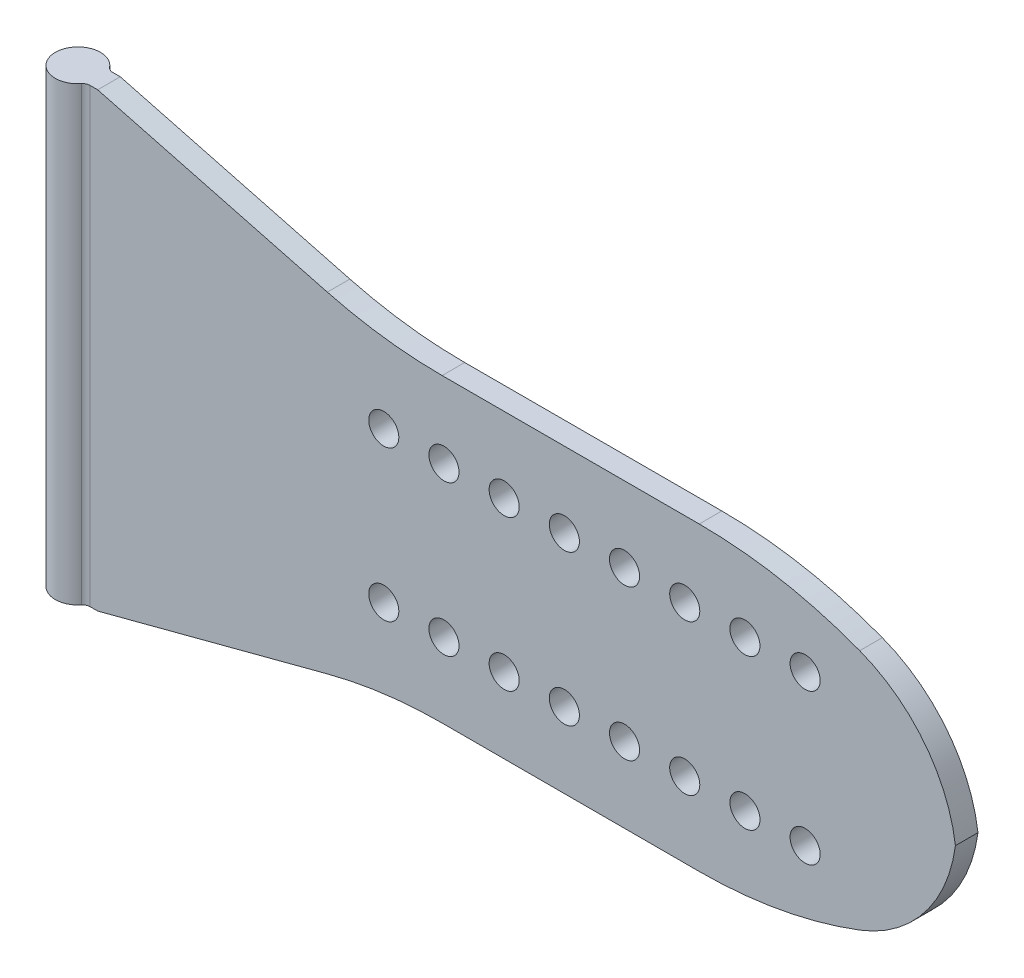
ISO-10303-21;
HEADER;
FILE_DESCRIPTION(('STEP AP214'),'2;1');
FILE_NAME('part.step','',(''),(''),'','','');
FILE_SCHEMA(('AUTOMOTIVE_DESIGN { 1 0 10303 214 1 1 1 1 }'));
ENDSEC;
DATA;
#1=APPLICATION_CONTEXT('core data for automotive mechanical design processes');
#2=APPLICATION_PROTOCOL_DEFINITION('international standard','automotive_design',2000,#1);
#3=PRODUCT_CONTEXT('',#1,'mechanical');
#4=PRODUCT('Part','Part','',(#3));
#5=PRODUCT_RELATED_PRODUCT_CATEGORY('part','',(#4));
#6=PRODUCT_DEFINITION_FORMATION('','',#4);
#7=PRODUCT_DEFINITION_CONTEXT('part definition',#1,'design');
#8=PRODUCT_DEFINITION('design','',#6,#7);
#9=PRODUCT_DEFINITION_SHAPE('','',#8);
#10=(LENGTH_UNIT() NAMED_UNIT(*) SI_UNIT(.MILLI.,.METRE.));
#11=(NAMED_UNIT(*) PLANE_ANGLE_UNIT() SI_UNIT($,.RADIAN.));
#12=(NAMED_UNIT(*) SI_UNIT($,.STERADIAN.) SOLID_ANGLE_UNIT());
#13=UNCERTAINTY_MEASURE_WITH_UNIT(LENGTH_MEASURE(1.E-05),#10,'distance_accuracy_value','');
#14=(GEOMETRIC_REPRESENTATION_CONTEXT(3) GLOBAL_UNCERTAINTY_ASSIGNED_CONTEXT((#13)) GLOBAL_UNIT_ASSIGNED_CONTEXT((#10,
#11,#12)) REPRESENTATION_CONTEXT('',''));
#15=CARTESIAN_POINT('',(0.,0.,0.));
#16=DIRECTION('',(0.,0.,1.));
#17=DIRECTION('',(1.,0.,0.));
#18=AXIS2_PLACEMENT_3D('',#15,#16,#17);
#19=CARTESIAN_POINT('',(0.,-15.,0.));
#20=DIRECTION('',(0.,1.,0.));
#21=DIRECTION('',(0.,0.,1.));
#22=AXIS2_PLACEMENT_3D('',#19,#20,#21);
#23=CYLINDRICAL_SURFACE('',#22,1.5);
#24=DIRECTION('',(0.,1.,0.));
#25=VECTOR('',#24,1.);
#26=CARTESIAN_POINT('',(1.1709371246997,-15.,0.9375));
#27=LINE('',#26,#25);
#28=CARTESIAN_POINT('',(1.1709371246997,-15.,0.9375));
#29=VERTEX_POINT('',#28);
#30=CARTESIAN_POINT('',(1.1709371246997,15.,0.9375));
#31=VERTEX_POINT('',#30);
#32=EDGE_CURVE('E195',#29,#31,#27,.T.);
#33=ORIENTED_EDGE('',*,*,#32,.T.);
#34=CARTESIAN_POINT('',(0.,15.,0.));
#35=DIRECTION('',(0.,1.,0.));
#36=DIRECTION('',(0.,0.,1.));
#37=AXIS2_PLACEMENT_3D('',#34,#35,#36);
#38=CIRCLE('',#37,1.5);
#39=CARTESIAN_POINT('',(1.1709371246997,15.,-0.9375));
#40=VERTEX_POINT('',#39);
#41=EDGE_CURVE('E175',#40,#31,#38,.T.);
#42=ORIENTED_EDGE('',*,*,#41,.F.);
#43=DIRECTION('',(0.,1.,0.));
#44=VECTOR('',#43,1.);
#45=CARTESIAN_POINT('',(1.1709371246997,-15.,-0.9375));
#46=LINE('',#45,#44);
#47=CARTESIAN_POINT('',(1.1709371246997,-15.,-0.9375));
#48=VERTEX_POINT('',#47);
#49=EDGE_CURVE('E153',#48,#40,#46,.T.);
#50=ORIENTED_EDGE('',*,*,#49,.F.);
#51=CARTESIAN_POINT('',(0.,-15.,0.));
#52=DIRECTION('',(0.,1.,0.));
#53=DIRECTION('',(0.,0.,1.));
#54=AXIS2_PLACEMENT_3D('',#51,#52,#53);
#55=CIRCLE('',#54,1.5);
#56=EDGE_CURVE('E181',#48,#29,#55,.T.);
#57=ORIENTED_EDGE('',*,*,#56,.T.);
#58=EDGE_LOOP('',(#33,#42,#50,#57));
#59=FACE_BOUND('',#58,.T.);
#60=ADVANCED_FACE('F34',(#59),#23,.T.);
#61=CARTESIAN_POINT('',(1.5612494995996,-15.,-1.25));
#62=DIRECTION('',(0.,1.,0.));
#63=DIRECTION('',(0.,0.,1.));
#64=AXIS2_PLACEMENT_3D('',#61,#62,#63);
#65=CYLINDRICAL_SURFACE('',#64,0.5);
#66=ORIENTED_EDGE('',*,*,#49,.T.);
#67=CARTESIAN_POINT('',(1.5612494995996,15.,-1.25));
#68=DIRECTION('',(0.,-1.,0.));
#69=DIRECTION('',(0.,0.,-1.));
#70=AXIS2_PLACEMENT_3D('',#67,#68,#69);
#71=CIRCLE('',#70,0.5);
#72=CARTESIAN_POINT('',(1.5612494995996,15.,-0.75));
#73=VERTEX_POINT('',#72);
#74=EDGE_CURVE('E173',#73,#40,#71,.T.);
#75=ORIENTED_EDGE('',*,*,#74,.F.);
#76=DIRECTION('',(0.,1.,0.));
#77=VECTOR('',#76,1.);
#78=CARTESIAN_POINT('',(1.5612494995996,-15.,-0.75));
#79=LINE('',#78,#77);
#80=CARTESIAN_POINT('',(1.5612494995996,-15.,-0.75));
#81=VERTEX_POINT('',#80);
#82=EDGE_CURVE('E197',#81,#73,#79,.T.);
#83=ORIENTED_EDGE('',*,*,#82,.F.);
#84=CARTESIAN_POINT('',(1.5612494995996,-15.,-1.25));
#85=DIRECTION('',(0.,-1.,0.));
#86=DIRECTION('',(0.,0.,-1.));
#87=AXIS2_PLACEMENT_3D('',#84,#85,#86);
#88=CIRCLE('',#87,0.5);
#89=EDGE_CURVE('E192',#81,#48,#88,.T.);
#90=ORIENTED_EDGE('',*,*,#89,.T.);
#91=EDGE_LOOP('',(#66,#75,#83,#90));
#92=FACE_BOUND('',#91,.T.);
#93=ADVANCED_FACE('F409',(#92),#65,.F.);
#94=CARTESIAN_POINT('',(1.5612494995996,-15.,-0.75));
#95=DIRECTION('',(0.,0.,-1.));
#96=DIRECTION('',(-1.,0.,0.));
#97=AXIS2_PLACEMENT_3D('',#94,#95,#96);
#98=PLANE('',#97);
#99=CARTESIAN_POINT('',(37.0772494995997,-5.00000000000008,-0.749999999999996));
#100=DIRECTION('',(0.,0.,-1.));
#101=DIRECTION('',(-1.,0.,0.));
#102=AXIS2_PLACEMENT_3D('',#99,#100,#101);
#103=CIRCLE('',#102,0.999999999999998);
#104=CARTESIAN_POINT('',(36.0772494995997,-5.00000000000008,-0.749999999999996));
#105=VERTEX_POINT('',#104);
#106=EDGE_CURVE('E370',#105,#105,#103,.T.);
#107=ORIENTED_EDGE('',*,*,#106,.F.);
#108=EDGE_LOOP('',(#107));
#109=FACE_BOUND('',#108,.T.);
#110=CARTESIAN_POINT('',(41.0772494995997,-5.00000000000006,-0.749999999999996));
#111=DIRECTION('',(0.,0.,-1.));
#112=DIRECTION('',(-1.,0.,0.));
#113=AXIS2_PLACEMENT_3D('',#110,#111,#112);
#114=CIRCLE('',#113,0.999999999999998);
#115=CARTESIAN_POINT('',(40.0772494995997,-5.00000000000006,-0.749999999999996));
#116=VERTEX_POINT('',#115);
#117=EDGE_CURVE('E367',#116,#116,#114,.T.);
#118=ORIENTED_EDGE('',*,*,#117,.F.);
#119=EDGE_LOOP('',(#118));
#120=FACE_BOUND('',#119,.T.);
#121=CARTESIAN_POINT('',(45.0772494995997,-5.00000000000003,-0.749999999999995));
#122=DIRECTION('',(0.,0.,-1.));
#123=DIRECTION('',(-1.,0.,0.));
#124=AXIS2_PLACEMENT_3D('',#121,#122,#123);
#125=CIRCLE('',#124,0.999999999999998);
#126=CARTESIAN_POINT('',(44.0772494995997,-5.00000000000003,-0.749999999999995));
#127=VERTEX_POINT('',#126);
#128=EDGE_CURVE('E364',#127,#127,#125,.T.);
#129=ORIENTED_EDGE('',*,*,#128,.F.);
#130=EDGE_LOOP('',(#129));
#131=FACE_BOUND('',#130,.T.);
#132=CARTESIAN_POINT('',(21.0772494995996,4.9999999999998,-0.749999999999998));
#133=DIRECTION('',(0.,0.,-1.));
#134=DIRECTION('',(-1.,0.,0.));
#135=AXIS2_PLACEMENT_3D('',#132,#133,#134);
#136=CIRCLE('',#135,0.999999999999998);
#137=CARTESIAN_POINT('',(20.0772494995996,4.9999999999998,-0.749999999999998));
#138=VERTEX_POINT('',#137);
#139=EDGE_CURVE('E361',#138,#138,#136,.T.);
#140=ORIENTED_EDGE('',*,*,#139,.F.);
#141=EDGE_LOOP('',(#140));
#142=FACE_BOUND('',#141,.T.);
#143=CARTESIAN_POINT('',(33.0772494995997,-5.00000000000011,-0.749999999999997));
#144=DIRECTION('',(0.,0.,-1.));
#145=DIRECTION('',(-1.,0.,0.));
#146=AXIS2_PLACEMENT_3D('',#143,#144,#145);
#147=CIRCLE('',#146,0.999999999999998);
#148=CARTESIAN_POINT('',(32.0772494995997,-5.00000000000011,-0.749999999999997));
#149=VERTEX_POINT('',#148);
#150=EDGE_CURVE('E358',#149,#149,#147,.T.);
#151=ORIENTED_EDGE('',*,*,#150,.F.);
#152=EDGE_LOOP('',(#151));
#153=FACE_BOUND('',#152,.T.);
#154=CARTESIAN_POINT('',(29.0772494995997,-5.00000000000014,-0.749999999999997));
#155=DIRECTION('',(0.,0.,-1.));
#156=DIRECTION('',(-1.,0.,0.));
#157=AXIS2_PLACEMENT_3D('',#154,#155,#156);
#158=CIRCLE('',#157,0.999999999999998);
#159=CARTESIAN_POINT('',(28.0772494995997,-5.00000000000014,-0.749999999999997));
#160=VERTEX_POINT('',#159);
#161=EDGE_CURVE('E355',#160,#160,#158,.T.);
#162=ORIENTED_EDGE('',*,*,#161,.F.);
#163=EDGE_LOOP('',(#162));
#164=FACE_BOUND('',#163,.T.);
#165=CARTESIAN_POINT('',(25.0772494995997,-5.00000000000017,-0.749999999999997));
#166=DIRECTION('',(0.,0.,-1.));
#167=DIRECTION('',(-1.,0.,0.));
#168=AXIS2_PLACEMENT_3D('',#165,#166,#167);
#169=CIRCLE('',#168,0.999999999999998);
#170=CARTESIAN_POINT('',(24.0772494995997,-5.00000000000017,-0.749999999999998));
#171=VERTEX_POINT('',#170);
#172=EDGE_CURVE('E352',#171,#171,#169,.T.);
#173=ORIENTED_EDGE('',*,*,#172,.F.);
#174=EDGE_LOOP('',(#173));
#175=FACE_BOUND('',#174,.T.);
#176=CARTESIAN_POINT('',(21.0772494995997,-5.0000000000002,-0.749999999999998));
#177=DIRECTION('',(0.,0.,-1.));
#178=DIRECTION('',(-1.,0.,0.));
#179=AXIS2_PLACEMENT_3D('',#176,#177,#178);
#180=CIRCLE('',#179,0.999999999999998);
#181=CARTESIAN_POINT('',(20.0772494995997,-5.0000000000002,-0.749999999999998));
#182=VERTEX_POINT('',#181);
#183=EDGE_CURVE('E349',#182,#182,#180,.T.);
#184=ORIENTED_EDGE('',*,*,#183,.F.);
#185=EDGE_LOOP('',(#184));
#186=FACE_BOUND('',#185,.T.);
#187=CARTESIAN_POINT('',(41.0772494995996,4.99999999999994,-0.749999999999996));
#188=DIRECTION('',(0.,0.,-1.));
#189=DIRECTION('',(-1.,0.,0.));
#190=AXIS2_PLACEMENT_3D('',#187,#188,#189);
#191=CIRCLE('',#190,0.999999999999998);
#192=CARTESIAN_POINT('',(40.0772494995996,4.99999999999994,-0.749999999999996));
#193=VERTEX_POINT('',#192);
#194=EDGE_CURVE('E346',#193,#193,#191,.T.);
#195=ORIENTED_EDGE('',*,*,#194,.F.);
#196=EDGE_LOOP('',(#195));
#197=FACE_BOUND('',#196,.T.);
#198=CARTESIAN_POINT('',(45.0772494995996,4.99999999999997,-0.749999999999995));
#199=DIRECTION('',(0.,0.,-1.));
#200=DIRECTION('',(-1.,0.,0.));
#201=AXIS2_PLACEMENT_3D('',#198,#199,#200);
#202=CIRCLE('',#201,0.999999999999998);
#203=CARTESIAN_POINT('',(44.0772494995996,4.99999999999997,-0.749999999999995));
#204=VERTEX_POINT('',#203);
#205=EDGE_CURVE('E343',#204,#204,#202,.T.);
#206=ORIENTED_EDGE('',*,*,#205,.F.);
#207=EDGE_LOOP('',(#206));
#208=FACE_BOUND('',#207,.T.);
#209=CARTESIAN_POINT('',(49.0772494995996,5.,-0.749999999999995));
#210=DIRECTION('',(0.,0.,-1.));
#211=DIRECTION('',(-1.,0.,0.));
#212=AXIS2_PLACEMENT_3D('',#209,#210,#211);
#213=CIRCLE('',#212,0.999999999999998);
#214=CARTESIAN_POINT('',(48.0772494995996,5.,-0.749999999999995));
#215=VERTEX_POINT('',#214);
#216=EDGE_CURVE('E340',#215,#215,#213,.T.);
#217=ORIENTED_EDGE('',*,*,#216,.F.);
#218=EDGE_LOOP('',(#217));
#219=FACE_BOUND('',#218,.T.);
#220=CARTESIAN_POINT('',(49.1512494995996,-1.30626791769696,-0.749999999999995));
#221=DIRECTION('',(0.,0.,-1.));
#222=DIRECTION('',(-1.,0.,0.));
#223=AXIS2_PLACEMENT_3D('',#220,#221,#222);
#224=CIRCLE('',#223,10.);
#225=CARTESIAN_POINT('',(52.7059780699364,8.04059812345455,-0.749999999999994));
#226=VERTEX_POINT('',#225);
#227=CARTESIAN_POINT('',(59.0655656195948,0.,-0.749999999999994));
#228=VERTEX_POINT('',#227);
#229=EDGE_CURVE('E50',#226,#228,#224,.T.);
#230=ORIENTED_EDGE('',*,*,#229,.T.);
#231=CARTESIAN_POINT('',(49.1512494995996,1.30626791769696,-0.749999999999995));
#232=DIRECTION('',(0.,0.,-1.));
#233=DIRECTION('',(-1.,0.,0.));
#234=AXIS2_PLACEMENT_3D('',#231,#232,#233);
#235=CIRCLE('',#234,10.);
#236=CARTESIAN_POINT('',(52.7059780699364,-8.04059812345455,-0.749999999999994));
#237=VERTEX_POINT('',#236);
#238=EDGE_CURVE('E43',#228,#237,#235,.T.);
#239=ORIENTED_EDGE('',*,*,#238,.T.);
#240=CARTESIAN_POINT('',(42.041792358926,20.,-0.749999999999996));
#241=DIRECTION('',(0.,0.,-1.));
#242=DIRECTION('',(-1.,0.,0.));
#243=AXIS2_PLACEMENT_3D('',#240,#241,#242);
#244=CIRCLE('',#243,30.);
#245=CARTESIAN_POINT('',(42.041792358926,-10.,-0.749999999999996));
#246=VERTEX_POINT('',#245);
#247=EDGE_CURVE('E219',#237,#246,#244,.T.);
#248=ORIENTED_EDGE('',*,*,#247,.T.);
#249=DIRECTION('',(1.,0.,0.));
#250=VECTOR('',#249,1.);
#251=CARTESIAN_POINT('',(1.5612494995996,-10.,-0.75));
#252=LINE('',#251,#250);
#253=CARTESIAN_POINT('',(24.9561765158804,-10.,-0.749999999999997));
#254=VERTEX_POINT('',#253);
#255=EDGE_CURVE('E338',#254,#246,#252,.T.);
#256=ORIENTED_EDGE('',*,*,#255,.F.);
#257=CARTESIAN_POINT('',(24.9561765158804,-40.,-0.749999999999997));
#258=DIRECTION('',(0.,0.,-1.));
#259=DIRECTION('',(-1.,0.,0.));
#260=AXIS2_PLACEMENT_3D('',#257,#258,#259);
#261=CIRCLE('',#260,30.);
#262=CARTESIAN_POINT('',(17.3258846413979,-10.9865781764679,-0.749999999999998));
#263=VERTEX_POINT('',#262);
#264=EDGE_CURVE('E230',#254,#263,#261,.F.);
#265=ORIENTED_EDGE('',*,*,#264,.T.);
#266=DIRECTION('',(0.967114060784402,0.254343062482749,0.));
#267=VECTOR('',#266,1.);
#268=CARTESIAN_POINT('',(1.59385345788989,-15.123973291003,-0.75));
#269=LINE('',#268,#267);
#270=CARTESIAN_POINT('',(2.0652494995996,-15.,-0.749999999999997));
#271=VERTEX_POINT('',#270);
#272=EDGE_CURVE('E317',#271,#263,#269,.T.);
#273=ORIENTED_EDGE('',*,*,#272,.F.);
#274=DIRECTION('',(-1.,0.,0.));
#275=VECTOR('',#274,1.);
#276=CARTESIAN_POINT('',(1.5612494995996,-15.,-0.75));
#277=LINE('',#276,#275);
#278=EDGE_CURVE('E190',#271,#81,#277,.T.);
#279=ORIENTED_EDGE('',*,*,#278,.T.);
#280=ORIENTED_EDGE('',*,*,#82,.T.);
#281=DIRECTION('',(-1.,0.,0.));
#282=VECTOR('',#281,1.);
#283=CARTESIAN_POINT('',(1.5612494995996,15.,-0.75));
#284=LINE('',#283,#282);
#285=CARTESIAN_POINT('',(2.06524949959961,15.,-0.75));
#286=VERTEX_POINT('',#285);
#287=EDGE_CURVE('E171',#286,#73,#284,.T.);
#288=ORIENTED_EDGE('',*,*,#287,.F.);
#289=DIRECTION('',(-0.967114060784402,0.254343062482749,0.));
#290=VECTOR('',#289,1.);
#291=CARTESIAN_POINT('',(8.97321601759084,13.1832614880099,-0.749999999999999));
#292=LINE('',#291,#290);
#293=CARTESIAN_POINT('',(17.325884641398,10.9865781764679,-0.749999999999998));
#294=VERTEX_POINT('',#293);
#295=EDGE_CURVE('E148',#294,#286,#292,.T.);
#296=ORIENTED_EDGE('',*,*,#295,.F.);
#297=CARTESIAN_POINT('',(24.9561765158804,40.,-0.749999999999997));
#298=DIRECTION('',(0.,0.,-1.));
#299=DIRECTION('',(-1.,0.,0.));
#300=AXIS2_PLACEMENT_3D('',#297,#298,#299);
#301=CIRCLE('',#300,30.);
#302=CARTESIAN_POINT('',(24.9561765158804,10.,-0.749999999999997));
#303=VERTEX_POINT('',#302);
#304=EDGE_CURVE('E233',#294,#303,#301,.F.);
#305=ORIENTED_EDGE('',*,*,#304,.T.);
#306=DIRECTION('',(-1.,0.,0.));
#307=VECTOR('',#306,1.);
#308=CARTESIAN_POINT('',(1.5612494995996,10.,-0.75));
#309=LINE('',#308,#307);
#310=CARTESIAN_POINT('',(42.041792358926,10.,-0.749999999999996));
#311=VERTEX_POINT('',#310);
#312=EDGE_CURVE('E320',#311,#303,#309,.T.);
#313=ORIENTED_EDGE('',*,*,#312,.F.);
#314=CARTESIAN_POINT('',(42.041792358926,-20.,-0.749999999999996));
#315=DIRECTION('',(0.,0.,-1.));
#316=DIRECTION('',(-1.,0.,0.));
#317=AXIS2_PLACEMENT_3D('',#314,#315,#316);
#318=CIRCLE('',#317,30.);
#319=EDGE_CURVE('E217',#311,#226,#318,.T.);
#320=ORIENTED_EDGE('',*,*,#319,.T.);
#321=EDGE_LOOP('',(#230,#239,#248,#256,#265,#273,#279,#280,#288,#296,#305,#313,#320));
#322=FACE_BOUND('',#321,.T.);
#323=CARTESIAN_POINT('',(37.0772494995996,4.99999999999992,-0.749999999999996));
#324=DIRECTION('',(0.,0.,-1.));
#325=DIRECTION('',(-1.,0.,0.));
#326=AXIS2_PLACEMENT_3D('',#323,#324,#325);
#327=CIRCLE('',#326,0.999999999999998);
#328=CARTESIAN_POINT('',(36.0772494995996,4.99999999999992,-0.749999999999996));
#329=VERTEX_POINT('',#328);
#330=EDGE_CURVE('E335',#329,#329,#327,.T.);
#331=ORIENTED_EDGE('',*,*,#330,.F.);
#332=EDGE_LOOP('',(#331));
#333=FACE_BOUND('',#332,.T.);
#334=CARTESIAN_POINT('',(33.0772494995996,4.99999999999989,-0.749999999999997));
#335=DIRECTION('',(0.,0.,-1.));
#336=DIRECTION('',(-1.,0.,0.));
#337=AXIS2_PLACEMENT_3D('',#334,#335,#336);
#338=CIRCLE('',#337,0.999999999999998);
#339=CARTESIAN_POINT('',(32.0772494995996,4.99999999999989,-0.749999999999997));
#340=VERTEX_POINT('',#339);
#341=EDGE_CURVE('E332',#340,#340,#338,.T.);
#342=ORIENTED_EDGE('',*,*,#341,.F.);
#343=EDGE_LOOP('',(#342));
#344=FACE_BOUND('',#343,.T.);
#345=CARTESIAN_POINT('',(29.0772494995996,4.99999999999986,-0.749999999999997));
#346=DIRECTION('',(0.,0.,-1.));
#347=DIRECTION('',(-1.,0.,0.));
#348=AXIS2_PLACEMENT_3D('',#345,#346,#347);
#349=CIRCLE('',#348,0.999999999999998);
#350=CARTESIAN_POINT('',(28.0772494995996,4.99999999999986,-0.749999999999997));
#351=VERTEX_POINT('',#350);
#352=EDGE_CURVE('E329',#351,#351,#349,.T.);
#353=ORIENTED_EDGE('',*,*,#352,.F.);
#354=EDGE_LOOP('',(#353));
#355=FACE_BOUND('',#354,.T.);
#356=CARTESIAN_POINT('',(25.0772494995996,4.99999999999983,-0.749999999999997));
#357=DIRECTION('',(0.,0.,-1.));
#358=DIRECTION('',(-1.,0.,0.));
#359=AXIS2_PLACEMENT_3D('',#356,#357,#358);
#360=CIRCLE('',#359,0.999999999999998);
#361=CARTESIAN_POINT('',(24.0772494995996,4.99999999999983,-0.749999999999998));
#362=VERTEX_POINT('',#361);
#363=EDGE_CURVE('E326',#362,#362,#360,.T.);
#364=ORIENTED_EDGE('',*,*,#363,.F.);
#365=EDGE_LOOP('',(#364));
#366=FACE_BOUND('',#365,.T.);
#367=CARTESIAN_POINT('',(49.0772494995997,-5.,-0.749999999999995));
#368=DIRECTION('',(0.,0.,-1.));
#369=DIRECTION('',(-1.,0.,0.));
#370=AXIS2_PLACEMENT_3D('',#367,#368,#369);
#371=CIRCLE('',#370,0.999999999999998);
#372=CARTESIAN_POINT('',(48.0772494995997,-5.,-0.749999999999995));
#373=VERTEX_POINT('',#372);
#374=EDGE_CURVE('E323',#373,#373,#371,.T.);
#375=ORIENTED_EDGE('',*,*,#374,.F.);
#376=EDGE_LOOP('',(#375));
#377=FACE_BOUND('',#376,.T.);
#378=ADVANCED_FACE('F245',(#109,#120,#131,#142,#153,#164,#175,#186,#197,#208,#219,#322,#333,
#344,#355,#366,#377),#98,.T.);
#379=CARTESIAN_POINT('',(59.1512494995996,-15.,0.749999999999994));
#380=DIRECTION('',(0.,0.,1.));
#381=DIRECTION('',(1.,0.,0.));
#382=AXIS2_PLACEMENT_3D('',#379,#380,#381);
#383=PLANE('',#382);
#384=CARTESIAN_POINT('',(37.0772494995997,-5.00000000000008,0.75));
#385=DIRECTION('',(0.,0.,1.));
#386=DIRECTION('',(1.,0.,0.));
#387=AXIS2_PLACEMENT_3D('',#384,#385,#386);
#388=CIRCLE('',#387,0.999999999999998);
#389=CARTESIAN_POINT('',(38.0772494995997,-5.00000000000008,0.75));
#390=VERTEX_POINT('',#389);
#391=EDGE_CURVE('E272',#390,#390,#388,.T.);
#392=ORIENTED_EDGE('',*,*,#391,.F.);
#393=EDGE_LOOP('',(#392));
#394=FACE_BOUND('',#393,.T.);
#395=CARTESIAN_POINT('',(41.0772494995997,-5.00000000000006,0.75));
#396=DIRECTION('',(0.,0.,1.));
#397=DIRECTION('',(1.,0.,0.));
#398=AXIS2_PLACEMENT_3D('',#395,#396,#397);
#399=CIRCLE('',#398,0.999999999999998);
#400=CARTESIAN_POINT('',(42.0772494995997,-5.00000000000006,0.75));
#401=VERTEX_POINT('',#400);
#402=EDGE_CURVE('E278',#401,#401,#399,.T.);
#403=ORIENTED_EDGE('',*,*,#402,.F.);
#404=EDGE_LOOP('',(#403));
#405=FACE_BOUND('',#404,.T.);
#406=CARTESIAN_POINT('',(45.0772494995997,-5.00000000000003,0.75));
#407=DIRECTION('',(0.,0.,1.));
#408=DIRECTION('',(1.,0.,0.));
#409=AXIS2_PLACEMENT_3D('',#406,#407,#408);
#410=CIRCLE('',#409,0.999999999999998);
#411=CARTESIAN_POINT('',(46.0772494995997,-5.00000000000003,0.75));
#412=VERTEX_POINT('',#411);
#413=EDGE_CURVE('E281',#412,#412,#410,.T.);
#414=ORIENTED_EDGE('',*,*,#413,.F.);
#415=EDGE_LOOP('',(#414));
#416=FACE_BOUND('',#415,.T.);
#417=CARTESIAN_POINT('',(21.0772494995996,4.9999999999998,0.75));
#418=DIRECTION('',(0.,0.,1.));
#419=DIRECTION('',(1.,0.,0.));
#420=AXIS2_PLACEMENT_3D('',#417,#418,#419);
#421=CIRCLE('',#420,0.999999999999998);
#422=CARTESIAN_POINT('',(22.0772494995996,4.9999999999998,0.75));
#423=VERTEX_POINT('',#422);
#424=EDGE_CURVE('E284',#423,#423,#421,.T.);
#425=ORIENTED_EDGE('',*,*,#424,.F.);
#426=EDGE_LOOP('',(#425));
#427=FACE_BOUND('',#426,.T.);
#428=CARTESIAN_POINT('',(33.0772494995997,-5.00000000000011,0.75));
#429=DIRECTION('',(0.,0.,1.));
#430=DIRECTION('',(1.,0.,0.));
#431=AXIS2_PLACEMENT_3D('',#428,#429,#430);
#432=CIRCLE('',#431,0.999999999999998);
#433=CARTESIAN_POINT('',(34.0772494995997,-5.00000000000011,0.75));
#434=VERTEX_POINT('',#433);
#435=EDGE_CURVE('E269',#434,#434,#432,.T.);
#436=ORIENTED_EDGE('',*,*,#435,.F.);
#437=EDGE_LOOP('',(#436));
#438=FACE_BOUND('',#437,.T.);
#439=CARTESIAN_POINT('',(29.0772494995997,-5.00000000000014,0.75));
#440=DIRECTION('',(0.,0.,1.));
#441=DIRECTION('',(1.,0.,0.));
#442=AXIS2_PLACEMENT_3D('',#439,#440,#441);
#443=CIRCLE('',#442,0.999999999999998);
#444=CARTESIAN_POINT('',(30.0772494995997,-5.00000000000014,0.75));
#445=VERTEX_POINT('',#444);
#446=EDGE_CURVE('E273',#445,#445,#443,.T.);
#447=ORIENTED_EDGE('',*,*,#446,.F.);
#448=EDGE_LOOP('',(#447));
#449=FACE_BOUND('',#448,.T.);
#450=CARTESIAN_POINT('',(25.0772494995997,-5.00000000000017,0.75));
#451=DIRECTION('',(0.,0.,1.));
#452=DIRECTION('',(1.,0.,0.));
#453=AXIS2_PLACEMENT_3D('',#450,#451,#452);
#454=CIRCLE('',#453,0.999999999999998);
#455=CARTESIAN_POINT('',(26.0772494995997,-5.00000000000017,0.75));
#456=VERTEX_POINT('',#455);
#457=EDGE_CURVE('E266',#456,#456,#454,.T.);
#458=ORIENTED_EDGE('',*,*,#457,.F.);
#459=EDGE_LOOP('',(#458));
#460=FACE_BOUND('',#459,.T.);
#461=CARTESIAN_POINT('',(21.0772494995997,-5.0000000000002,0.75));
#462=DIRECTION('',(0.,0.,1.));
#463=DIRECTION('',(1.,0.,0.));
#464=AXIS2_PLACEMENT_3D('',#461,#462,#463);
#465=CIRCLE('',#464,0.999999999999998);
#466=CARTESIAN_POINT('',(22.0772494995997,-5.0000000000002,0.75));
#467=VERTEX_POINT('',#466);
#468=EDGE_CURVE('E261',#467,#467,#465,.T.);
#469=ORIENTED_EDGE('',*,*,#468,.F.);
#470=EDGE_LOOP('',(#469));
#471=FACE_BOUND('',#470,.T.);
#472=CARTESIAN_POINT('',(41.0772494995996,4.99999999999994,0.75));
#473=DIRECTION('',(0.,0.,1.));
#474=DIRECTION('',(1.,0.,0.));
#475=AXIS2_PLACEMENT_3D('',#472,#473,#474);
#476=CIRCLE('',#475,0.999999999999998);
#477=CARTESIAN_POINT('',(42.0772494995996,4.99999999999994,0.75));
#478=VERTEX_POINT('',#477);
#479=EDGE_CURVE('E293',#478,#478,#476,.T.);
#480=ORIENTED_EDGE('',*,*,#479,.F.);
#481=EDGE_LOOP('',(#480));
#482=FACE_BOUND('',#481,.T.);
#483=CARTESIAN_POINT('',(45.0772494995996,4.99999999999997,0.75));
#484=DIRECTION('',(0.,0.,1.));
#485=DIRECTION('',(1.,0.,0.));
#486=AXIS2_PLACEMENT_3D('',#483,#484,#485);
#487=CIRCLE('',#486,0.999999999999998);
#488=CARTESIAN_POINT('',(46.0772494995996,4.99999999999997,0.75));
#489=VERTEX_POINT('',#488);
#490=EDGE_CURVE('E302',#489,#489,#487,.T.);
#491=ORIENTED_EDGE('',*,*,#490,.F.);
#492=EDGE_LOOP('',(#491));
#493=FACE_BOUND('',#492,.T.);
#494=CARTESIAN_POINT('',(49.0772494995996,5.,0.75));
#495=DIRECTION('',(0.,0.,1.));
#496=DIRECTION('',(1.,0.,0.));
#497=AXIS2_PLACEMENT_3D('',#494,#495,#496);
#498=CIRCLE('',#497,0.999999999999998);
#499=CARTESIAN_POINT('',(50.0772494995996,5.,0.75));
#500=VERTEX_POINT('',#499);
#501=EDGE_CURVE('E305',#500,#500,#498,.T.);
#502=ORIENTED_EDGE('',*,*,#501,.F.);
#503=EDGE_LOOP('',(#502));
#504=FACE_BOUND('',#503,.T.);
#505=CARTESIAN_POINT('',(42.041792358926,20.,0.749999999999995));
#506=DIRECTION('',(0.,0.,1.));
#507=DIRECTION('',(1.,0.,0.));
#508=AXIS2_PLACEMENT_3D('',#505,#506,#507);
#509=CIRCLE('',#508,30.);
#510=CARTESIAN_POINT('',(42.041792358926,-10.,0.75));
#511=VERTEX_POINT('',#510);
#512=CARTESIAN_POINT('',(52.7059780699364,-8.04059812345455,0.749999999999994));
#513=VERTEX_POINT('',#512);
#514=EDGE_CURVE('E215',#511,#513,#509,.T.);
#515=ORIENTED_EDGE('',*,*,#514,.T.);
#516=CARTESIAN_POINT('',(49.1512494995996,1.30626791769696,0.749999999999995));
#517=DIRECTION('',(0.,0.,1.));
#518=DIRECTION('',(1.,0.,0.));
#519=AXIS2_PLACEMENT_3D('',#516,#517,#518);
#520=CIRCLE('',#519,10.);
#521=CARTESIAN_POINT('',(59.0655656195948,0.,0.749999999999994));
#522=VERTEX_POINT('',#521);
#523=EDGE_CURVE('E240',#513,#522,#520,.T.);
#524=ORIENTED_EDGE('',*,*,#523,.T.);
#525=CARTESIAN_POINT('',(49.1512494995996,-1.30626791769696,0.749999999999995));
#526=DIRECTION('',(0.,0.,1.));
#527=DIRECTION('',(1.,0.,0.));
#528=AXIS2_PLACEMENT_3D('',#525,#526,#527);
#529=CIRCLE('',#528,10.);
#530=CARTESIAN_POINT('',(52.7059780699364,8.04059812345455,0.749999999999994));
#531=VERTEX_POINT('',#530);
#532=EDGE_CURVE('E238',#522,#531,#529,.T.);
#533=ORIENTED_EDGE('',*,*,#532,.T.);
#534=CARTESIAN_POINT('',(42.041792358926,-20.,0.749999999999995));
#535=DIRECTION('',(0.,0.,1.));
#536=DIRECTION('',(1.,0.,0.));
#537=AXIS2_PLACEMENT_3D('',#534,#535,#536);
#538=CIRCLE('',#537,30.);
#539=CARTESIAN_POINT('',(42.041792358926,10.,0.75));
#540=VERTEX_POINT('',#539);
#541=EDGE_CURVE('E213',#531,#540,#538,.T.);
#542=ORIENTED_EDGE('',*,*,#541,.T.);
#543=DIRECTION('',(1.,0.,0.));
#544=VECTOR('',#543,1.);
#545=CARTESIAN_POINT('',(49.0772494995996,10.,0.75));
#546=LINE('',#545,#544);
#547=CARTESIAN_POINT('',(24.9561765158804,10.,0.75));
#548=VERTEX_POINT('',#547);
#549=EDGE_CURVE('E163',#548,#540,#546,.T.);
#550=ORIENTED_EDGE('',*,*,#549,.F.);
#551=CARTESIAN_POINT('',(24.9561765158804,40.,0.749999999999998));
#552=DIRECTION('',(0.,0.,1.));
#553=DIRECTION('',(1.,0.,0.));
#554=AXIS2_PLACEMENT_3D('',#551,#552,#553);
#555=CIRCLE('',#554,30.);
#556=CARTESIAN_POINT('',(17.325884641398,10.9865781764679,0.75));
#557=VERTEX_POINT('',#556);
#558=EDGE_CURVE('E162',#548,#557,#555,.F.);
#559=ORIENTED_EDGE('',*,*,#558,.T.);
#560=DIRECTION('',(0.967114060784403,-0.254343062482749,0.));
#561=VECTOR('',#560,1.);
#562=CARTESIAN_POINT('',(21.0772494995996,10.,0.75));
#563=LINE('',#562,#561);
#564=CARTESIAN_POINT('',(2.0652494995996,15.,0.75));
#565=VERTEX_POINT('',#564);
#566=EDGE_CURVE('E145',#565,#557,#563,.T.);
#567=ORIENTED_EDGE('',*,*,#566,.F.);
#568=DIRECTION('',(1.,0.,0.));
#569=VECTOR('',#568,1.);
#570=CARTESIAN_POINT('',(59.1512494995996,15.,0.749999999999994));
#571=LINE('',#570,#569);
#572=CARTESIAN_POINT('',(1.5612494995996,15.,0.75));
#573=VERTEX_POINT('',#572);
#574=EDGE_CURVE('E160',#573,#565,#571,.T.);
#575=ORIENTED_EDGE('',*,*,#574,.F.);
#576=DIRECTION('',(0.,1.,0.));
#577=VECTOR('',#576,1.);
#578=CARTESIAN_POINT('',(1.5612494995996,-15.,0.75));
#579=LINE('',#578,#577);
#580=CARTESIAN_POINT('',(1.5612494995996,-15.,0.75));
#581=VERTEX_POINT('',#580);
#582=EDGE_CURVE('E200',#581,#573,#579,.T.);
#583=ORIENTED_EDGE('',*,*,#582,.F.);
#584=DIRECTION('',(1.,0.,0.));
#585=VECTOR('',#584,1.);
#586=CARTESIAN_POINT('',(59.1512494995996,-15.,0.749999999999994));
#587=LINE('',#586,#585);
#588=CARTESIAN_POINT('',(2.06524949959962,-15.,0.75));
#589=VERTEX_POINT('',#588);
#590=EDGE_CURVE('E187',#581,#589,#587,.T.);
#591=ORIENTED_EDGE('',*,*,#590,.T.);
#592=DIRECTION('',(-0.967114060784402,-0.254343062482749,0.));
#593=VECTOR('',#592,1.);
#594=CARTESIAN_POINT('',(21.0772494995996,-10.,0.75));
#595=LINE('',#594,#593);
#596=CARTESIAN_POINT('',(17.3258846413979,-10.9865781764679,0.75));
#597=VERTEX_POINT('',#596);
#598=EDGE_CURVE('E164',#597,#589,#595,.T.);
#599=ORIENTED_EDGE('',*,*,#598,.F.);
#600=CARTESIAN_POINT('',(24.9561765158804,-40.,0.749999999999998));
#601=DIRECTION('',(0.,0.,1.));
#602=DIRECTION('',(1.,0.,0.));
#603=AXIS2_PLACEMENT_3D('',#600,#601,#602);
#604=CIRCLE('',#603,30.);
#605=CARTESIAN_POINT('',(24.9561765158804,-10.,0.75));
#606=VERTEX_POINT('',#605);
#607=EDGE_CURVE('E228',#597,#606,#604,.F.);
#608=ORIENTED_EDGE('',*,*,#607,.T.);
#609=DIRECTION('',(-1.,0.,0.));
#610=VECTOR('',#609,1.);
#611=CARTESIAN_POINT('',(49.0772494995996,-10.,0.75));
#612=LINE('',#611,#610);
#613=EDGE_CURVE('E308',#511,#606,#612,.T.);
#614=ORIENTED_EDGE('',*,*,#613,.F.);
#615=EDGE_LOOP('',(#515,#524,#533,#542,#550,#559,#567,#575,#583,#591,#599,#608,#614));
#616=FACE_BOUND('',#615,.T.);
#617=CARTESIAN_POINT('',(37.0772494995996,4.99999999999992,0.75));
#618=DIRECTION('',(0.,0.,1.));
#619=DIRECTION('',(1.,0.,0.));
#620=AXIS2_PLACEMENT_3D('',#617,#618,#619);
#621=CIRCLE('',#620,0.999999999999998);
#622=CARTESIAN_POINT('',(38.0772494995996,4.99999999999992,0.75));
#623=VERTEX_POINT('',#622);
#624=EDGE_CURVE('E290',#623,#623,#621,.T.);
#625=ORIENTED_EDGE('',*,*,#624,.F.);
#626=EDGE_LOOP('',(#625));
#627=FACE_BOUND('',#626,.T.);
#628=CARTESIAN_POINT('',(33.0772494995996,4.99999999999989,0.75));
#629=DIRECTION('',(0.,0.,1.));
#630=DIRECTION('',(1.,0.,0.));
#631=AXIS2_PLACEMENT_3D('',#628,#629,#630);
#632=CIRCLE('',#631,0.999999999999998);
#633=CARTESIAN_POINT('',(34.0772494995996,4.99999999999989,0.75));
#634=VERTEX_POINT('',#633);
#635=EDGE_CURVE('E294',#634,#634,#632,.T.);
#636=ORIENTED_EDGE('',*,*,#635,.F.);
#637=EDGE_LOOP('',(#636));
#638=FACE_BOUND('',#637,.T.);
#639=CARTESIAN_POINT('',(29.0772494995996,4.99999999999986,0.75));
#640=DIRECTION('',(0.,0.,1.));
#641=DIRECTION('',(1.,0.,0.));
#642=AXIS2_PLACEMENT_3D('',#639,#640,#641);
#643=CIRCLE('',#642,0.999999999999998);
#644=CARTESIAN_POINT('',(30.0772494995996,4.99999999999986,0.75));
#645=VERTEX_POINT('',#644);
#646=EDGE_CURVE('E297',#645,#645,#643,.T.);
#647=ORIENTED_EDGE('',*,*,#646,.F.);
#648=EDGE_LOOP('',(#647));
#649=FACE_BOUND('',#648,.T.);
#650=CARTESIAN_POINT('',(25.0772494995996,4.99999999999983,0.75));
#651=DIRECTION('',(0.,0.,1.));
#652=DIRECTION('',(1.,0.,0.));
#653=AXIS2_PLACEMENT_3D('',#650,#651,#652);
#654=CIRCLE('',#653,0.999999999999998);
#655=CARTESIAN_POINT('',(26.0772494995996,4.99999999999983,0.75));
#656=VERTEX_POINT('',#655);
#657=EDGE_CURVE('E287',#656,#656,#654,.T.);
#658=ORIENTED_EDGE('',*,*,#657,.F.);
#659=EDGE_LOOP('',(#658));
#660=FACE_BOUND('',#659,.T.);
#661=CARTESIAN_POINT('',(49.0772494995997,-5.,0.75));
#662=DIRECTION('',(0.,0.,1.));
#663=DIRECTION('',(1.,0.,0.));
#664=AXIS2_PLACEMENT_3D('',#661,#662,#663);
#665=CIRCLE('',#664,0.999999999999998);
#666=CARTESIAN_POINT('',(50.0772494995997,-5.,0.75));
#667=VERTEX_POINT('',#666);
#668=EDGE_CURVE('E259',#667,#667,#665,.T.);
#669=ORIENTED_EDGE('',*,*,#668,.F.);
#670=EDGE_LOOP('',(#669));
#671=FACE_BOUND('',#670,.T.);
#672=ADVANCED_FACE('F158',(#394,#405,#416,#427,#438,#449,#460,#471,#482,#493,#504,#616,#627,
#638,#649,#660,#671),#383,.T.);
#673=CARTESIAN_POINT('',(1.5612494995996,-15.,1.25));
#674=DIRECTION('',(0.,1.,0.));
#675=DIRECTION('',(0.,0.,1.));
#676=AXIS2_PLACEMENT_3D('',#673,#674,#675);
#677=CYLINDRICAL_SURFACE('',#676,0.5);
#678=ORIENTED_EDGE('',*,*,#582,.T.);
#679=CARTESIAN_POINT('',(1.5612494995996,15.,1.25));
#680=DIRECTION('',(0.,-1.,0.));
#681=DIRECTION('',(0.,0.,1.));
#682=AXIS2_PLACEMENT_3D('',#679,#680,#681);
#683=CIRCLE('',#682,0.5);
#684=EDGE_CURVE('E170',#31,#573,#683,.T.);
#685=ORIENTED_EDGE('',*,*,#684,.F.);
#686=ORIENTED_EDGE('',*,*,#32,.F.);
#687=CARTESIAN_POINT('',(1.5612494995996,-15.,1.25));
#688=DIRECTION('',(0.,-1.,0.));
#689=DIRECTION('',(0.,0.,1.));
#690=AXIS2_PLACEMENT_3D('',#687,#688,#689);
#691=CIRCLE('',#690,0.5);
#692=EDGE_CURVE('E184',#29,#581,#691,.T.);
#693=ORIENTED_EDGE('',*,*,#692,.T.);
#694=EDGE_LOOP('',(#678,#685,#686,#693));
#695=FACE_BOUND('',#694,.T.);
#696=ADVANCED_FACE('F378',(#695),#677,.F.);
#697=CARTESIAN_POINT('',(0.,-15.,0.));
#698=DIRECTION('',(0.,1.,0.));
#699=DIRECTION('',(0.,0.,1.));
#700=AXIS2_PLACEMENT_3D('',#697,#698,#699);
#701=PLANE('',#700);
#702=ORIENTED_EDGE('',*,*,#278,.F.);
#703=DIRECTION('',(0.,0.,1.));
#704=VECTOR('',#703,1.);
#705=CARTESIAN_POINT('',(2.06524949959965,-15.,0.));
#706=LINE('',#705,#704);
#707=EDGE_CURVE('E152',#271,#589,#706,.T.);
#708=ORIENTED_EDGE('',*,*,#707,.T.);
#709=ORIENTED_EDGE('',*,*,#590,.F.);
#710=ORIENTED_EDGE('',*,*,#692,.F.);
#711=ORIENTED_EDGE('',*,*,#56,.F.);
#712=ORIENTED_EDGE('',*,*,#89,.F.);
#713=EDGE_LOOP('',(#702,#708,#709,#710,#711,#712));
#714=FACE_BOUND('',#713,.T.);
#715=ADVANCED_FACE('F383',(#714),#701,.F.);
#716=CARTESIAN_POINT('',(0.,15.,0.));
#717=DIRECTION('',(0.,1.,0.));
#718=DIRECTION('',(0.,0.,1.));
#719=AXIS2_PLACEMENT_3D('',#716,#717,#718);
#720=PLANE('',#719);
#721=DIRECTION('',(0.,0.,1.));
#722=VECTOR('',#721,1.);
#723=CARTESIAN_POINT('',(2.06524949959961,15.,0.));
#724=LINE('',#723,#722);
#725=EDGE_CURVE('E142',#286,#565,#724,.T.);
#726=ORIENTED_EDGE('',*,*,#725,.F.);
#727=ORIENTED_EDGE('',*,*,#287,.T.);
#728=ORIENTED_EDGE('',*,*,#74,.T.);
#729=ORIENTED_EDGE('',*,*,#41,.T.);
#730=ORIENTED_EDGE('',*,*,#684,.T.);
#731=ORIENTED_EDGE('',*,*,#574,.T.);
#732=EDGE_LOOP('',(#726,#727,#728,#729,#730,#731));
#733=FACE_BOUND('',#732,.T.);
#734=ADVANCED_FACE('F167',(#733),#720,.T.);
#735=CARTESIAN_POINT('',(49.0772494995996,10.,-1.5));
#736=DIRECTION('',(0.,-1.,0.));
#737=DIRECTION('',(0.,0.,-1.));
#738=AXIS2_PLACEMENT_3D('',#735,#736,#737);
#739=PLANE('',#738);
#740=ORIENTED_EDGE('',*,*,#549,.T.);
#741=DIRECTION('',(0.,0.,1.));
#742=VECTOR('',#741,1.);
#743=CARTESIAN_POINT('',(42.041792358926,10.,-1.5));
#744=LINE('',#743,#742);
#745=EDGE_CURVE('E224',#540,#311,#744,.F.);
#746=ORIENTED_EDGE('',*,*,#745,.T.);
#747=ORIENTED_EDGE('',*,*,#312,.T.);
#748=DIRECTION('',(0.,0.,1.));
#749=VECTOR('',#748,1.);
#750=CARTESIAN_POINT('',(24.9561765158804,10.,0.75));
#751=LINE('',#750,#749);
#752=EDGE_CURVE('E221',#303,#548,#751,.T.);
#753=ORIENTED_EDGE('',*,*,#752,.T.);
#754=EDGE_LOOP('',(#740,#746,#747,#753));
#755=FACE_BOUND('',#754,.T.);
#756=ADVANCED_FACE('F586',(#755),#739,.F.);
#757=CARTESIAN_POINT('',(21.0772494995996,10.,-1.5));
#758=DIRECTION('',(-0.254343062482749,-0.967114060784402,0.));
#759=DIRECTION('',(0.967114060784402,-0.254343062482749,0.));
#760=AXIS2_PLACEMENT_3D('',#757,#758,#759);
#761=PLANE('',#760);
#762=ORIENTED_EDGE('',*,*,#566,.T.);
#763=DIRECTION('',(0.,0.,1.));
#764=VECTOR('',#763,1.);
#765=CARTESIAN_POINT('',(17.325884641398,10.9865781764679,-0.749999999999999));
#766=LINE('',#765,#764);
#767=EDGE_CURVE('E226',#557,#294,#766,.F.);
#768=ORIENTED_EDGE('',*,*,#767,.T.);
#769=ORIENTED_EDGE('',*,*,#295,.T.);
#770=ORIENTED_EDGE('',*,*,#725,.T.);
#771=EDGE_LOOP('',(#762,#768,#769,#770));
#772=FACE_BOUND('',#771,.T.);
#773=ADVANCED_FACE('F144',(#772),#761,.F.);
#774=CARTESIAN_POINT('',(21.0772494995996,-10.,-1.5));
#775=DIRECTION('',(-0.254343062482749,0.967114060784402,0.));
#776=DIRECTION('',(-0.967114060784402,-0.254343062482749,0.));
#777=AXIS2_PLACEMENT_3D('',#774,#775,#776);
#778=PLANE('',#777);
#779=ORIENTED_EDGE('',*,*,#272,.T.);
#780=DIRECTION('',(0.,0.,1.));
#781=VECTOR('',#780,1.);
#782=CARTESIAN_POINT('',(17.3258846413979,-10.9865781764679,0.75));
#783=LINE('',#782,#781);
#784=EDGE_CURVE('E205',#263,#597,#783,.T.);
#785=ORIENTED_EDGE('',*,*,#784,.T.);
#786=ORIENTED_EDGE('',*,*,#598,.T.);
#787=ORIENTED_EDGE('',*,*,#707,.F.);
#788=EDGE_LOOP('',(#779,#785,#786,#787));
#789=FACE_BOUND('',#788,.T.);
#790=ADVANCED_FACE('F387',(#789),#778,.F.);
#791=CARTESIAN_POINT('',(49.0772494995996,-10.,-1.5));
#792=DIRECTION('',(0.,1.,0.));
#793=DIRECTION('',(0.,0.,1.));
#794=AXIS2_PLACEMENT_3D('',#791,#792,#793);
#795=PLANE('',#794);
#796=ORIENTED_EDGE('',*,*,#613,.T.);
#797=DIRECTION('',(0.,0.,1.));
#798=VECTOR('',#797,1.);
#799=CARTESIAN_POINT('',(24.9561765158804,-10.,-0.749999999999996));
#800=LINE('',#799,#798);
#801=EDGE_CURVE('E211',#606,#254,#800,.F.);
#802=ORIENTED_EDGE('',*,*,#801,.T.);
#803=ORIENTED_EDGE('',*,*,#255,.T.);
#804=DIRECTION('',(0.,0.,1.));
#805=VECTOR('',#804,1.);
#806=CARTESIAN_POINT('',(42.041792358926,-10.,-1.5));
#807=LINE('',#806,#805);
#808=EDGE_CURVE('E208',#246,#511,#807,.T.);
#809=ORIENTED_EDGE('',*,*,#808,.T.);
#810=EDGE_LOOP('',(#796,#802,#803,#809));
#811=FACE_BOUND('',#810,.T.);
#812=ADVANCED_FACE('F395',(#811),#795,.F.);
#813=CARTESIAN_POINT('',(49.0772494995997,-5.,-1.5));
#814=DIRECTION('',(0.,0.,1.));
#815=DIRECTION('',(1.,0.,0.));
#816=AXIS2_PLACEMENT_3D('',#813,#814,#815);
#817=CYLINDRICAL_SURFACE('',#816,0.999999999999998);
#818=ORIENTED_EDGE('',*,*,#374,.T.);
#819=EDGE_LOOP('',(#818));
#820=FACE_BOUND('',#819,.T.);
#821=ORIENTED_EDGE('',*,*,#668,.T.);
#822=EDGE_LOOP('',(#821));
#823=FACE_BOUND('',#822,.T.);
#824=ADVANCED_FACE('F397',(#820,#823),#817,.F.);
#825=CARTESIAN_POINT('',(25.0772494995996,4.99999999999983,-1.5));
#826=DIRECTION('',(0.,0.,1.));
#827=DIRECTION('',(1.,0.,0.));
#828=AXIS2_PLACEMENT_3D('',#825,#826,#827);
#829=CYLINDRICAL_SURFACE('',#828,0.999999999999998);
#830=ORIENTED_EDGE('',*,*,#363,.T.);
#831=EDGE_LOOP('',(#830));
#832=FACE_BOUND('',#831,.T.);
#833=ORIENTED_EDGE('',*,*,#657,.T.);
#834=EDGE_LOOP('',(#833));
#835=FACE_BOUND('',#834,.T.);
#836=ADVANCED_FACE('F403',(#832,#835),#829,.F.);
#837=CARTESIAN_POINT('',(29.0772494995996,4.99999999999986,-1.5));
#838=DIRECTION('',(0.,0.,1.));
#839=DIRECTION('',(1.,0.,0.));
#840=AXIS2_PLACEMENT_3D('',#837,#838,#839);
#841=CYLINDRICAL_SURFACE('',#840,0.999999999999998);
#842=ORIENTED_EDGE('',*,*,#352,.T.);
#843=EDGE_LOOP('',(#842));
#844=FACE_BOUND('',#843,.T.);
#845=ORIENTED_EDGE('',*,*,#646,.T.);
#846=EDGE_LOOP('',(#845));
#847=FACE_BOUND('',#846,.T.);
#848=ADVANCED_FACE('F556',(#844,#847),#841,.F.);
#849=CARTESIAN_POINT('',(33.0772494995996,4.99999999999989,-1.5));
#850=DIRECTION('',(0.,0.,1.));
#851=DIRECTION('',(1.,0.,0.));
#852=AXIS2_PLACEMENT_3D('',#849,#850,#851);
#853=CYLINDRICAL_SURFACE('',#852,0.999999999999998);
#854=ORIENTED_EDGE('',*,*,#341,.T.);
#855=EDGE_LOOP('',(#854));
#856=FACE_BOUND('',#855,.T.);
#857=ORIENTED_EDGE('',*,*,#635,.T.);
#858=EDGE_LOOP('',(#857));
#859=FACE_BOUND('',#858,.T.);
#860=ADVANCED_FACE('F548',(#856,#859),#853,.F.);
#861=CARTESIAN_POINT('',(37.0772494995996,4.99999999999992,-1.5));
#862=DIRECTION('',(0.,0.,1.));
#863=DIRECTION('',(1.,0.,0.));
#864=AXIS2_PLACEMENT_3D('',#861,#862,#863);
#865=CYLINDRICAL_SURFACE('',#864,0.999999999999998);
#866=ORIENTED_EDGE('',*,*,#330,.T.);
#867=EDGE_LOOP('',(#866));
#868=FACE_BOUND('',#867,.T.);
#869=ORIENTED_EDGE('',*,*,#624,.T.);
#870=EDGE_LOOP('',(#869));
#871=FACE_BOUND('',#870,.T.);
#872=ADVANCED_FACE('F541',(#868,#871),#865,.F.);
#873=CARTESIAN_POINT('',(49.0772494995996,5.,-1.5));
#874=DIRECTION('',(0.,0.,1.));
#875=DIRECTION('',(1.,0.,0.));
#876=AXIS2_PLACEMENT_3D('',#873,#874,#875);
#877=CYLINDRICAL_SURFACE('',#876,0.999999999999998);
#878=ORIENTED_EDGE('',*,*,#216,.T.);
#879=EDGE_LOOP('',(#878));
#880=FACE_BOUND('',#879,.T.);
#881=ORIENTED_EDGE('',*,*,#501,.T.);
#882=EDGE_LOOP('',(#881));
#883=FACE_BOUND('',#882,.T.);
#884=ADVANCED_FACE('F533',(#880,#883),#877,.F.);
#885=CARTESIAN_POINT('',(45.0772494995996,4.99999999999997,-1.5));
#886=DIRECTION('',(0.,0.,1.));
#887=DIRECTION('',(1.,0.,0.));
#888=AXIS2_PLACEMENT_3D('',#885,#886,#887);
#889=CYLINDRICAL_SURFACE('',#888,0.999999999999998);
#890=ORIENTED_EDGE('',*,*,#205,.T.);
#891=EDGE_LOOP('',(#890));
#892=FACE_BOUND('',#891,.T.);
#893=ORIENTED_EDGE('',*,*,#490,.T.);
#894=EDGE_LOOP('',(#893));
#895=FACE_BOUND('',#894,.T.);
#896=ADVANCED_FACE('F525',(#892,#895),#889,.F.);
#897=CARTESIAN_POINT('',(41.0772494995996,4.99999999999994,-1.5));
#898=DIRECTION('',(0.,0.,1.));
#899=DIRECTION('',(1.,0.,0.));
#900=AXIS2_PLACEMENT_3D('',#897,#898,#899);
#901=CYLINDRICAL_SURFACE('',#900,0.999999999999998);
#902=ORIENTED_EDGE('',*,*,#194,.T.);
#903=EDGE_LOOP('',(#902));
#904=FACE_BOUND('',#903,.T.);
#905=ORIENTED_EDGE('',*,*,#479,.T.);
#906=EDGE_LOOP('',(#905));
#907=FACE_BOUND('',#906,.T.);
#908=ADVANCED_FACE('F517',(#904,#907),#901,.F.);
#909=CARTESIAN_POINT('',(21.0772494995997,-5.0000000000002,-1.5));
#910=DIRECTION('',(0.,0.,1.));
#911=DIRECTION('',(1.,0.,0.));
#912=AXIS2_PLACEMENT_3D('',#909,#910,#911);
#913=CYLINDRICAL_SURFACE('',#912,0.999999999999998);
#914=ORIENTED_EDGE('',*,*,#183,.T.);
#915=EDGE_LOOP('',(#914));
#916=FACE_BOUND('',#915,.T.);
#917=ORIENTED_EDGE('',*,*,#468,.T.);
#918=EDGE_LOOP('',(#917));
#919=FACE_BOUND('',#918,.T.);
#920=ADVANCED_FACE('F509',(#916,#919),#913,.F.);
#921=CARTESIAN_POINT('',(25.0772494995997,-5.00000000000017,-1.5));
#922=DIRECTION('',(0.,0.,1.));
#923=DIRECTION('',(1.,0.,0.));
#924=AXIS2_PLACEMENT_3D('',#921,#922,#923);
#925=CYLINDRICAL_SURFACE('',#924,0.999999999999998);
#926=ORIENTED_EDGE('',*,*,#172,.T.);
#927=EDGE_LOOP('',(#926));
#928=FACE_BOUND('',#927,.T.);
#929=ORIENTED_EDGE('',*,*,#457,.T.);
#930=EDGE_LOOP('',(#929));
#931=FACE_BOUND('',#930,.T.);
#932=ADVANCED_FACE('F501',(#928,#931),#925,.F.);
#933=CARTESIAN_POINT('',(29.0772494995997,-5.00000000000014,-1.5));
#934=DIRECTION('',(0.,0.,1.));
#935=DIRECTION('',(1.,0.,0.));
#936=AXIS2_PLACEMENT_3D('',#933,#934,#935);
#937=CYLINDRICAL_SURFACE('',#936,0.999999999999998);
#938=ORIENTED_EDGE('',*,*,#161,.T.);
#939=EDGE_LOOP('',(#938));
#940=FACE_BOUND('',#939,.T.);
#941=ORIENTED_EDGE('',*,*,#446,.T.);
#942=EDGE_LOOP('',(#941));
#943=FACE_BOUND('',#942,.T.);
#944=ADVANCED_FACE('F493',(#940,#943),#937,.F.);
#945=CARTESIAN_POINT('',(33.0772494995997,-5.00000000000011,-1.5));
#946=DIRECTION('',(0.,0.,1.));
#947=DIRECTION('',(1.,0.,0.));
#948=AXIS2_PLACEMENT_3D('',#945,#946,#947);
#949=CYLINDRICAL_SURFACE('',#948,0.999999999999998);
#950=ORIENTED_EDGE('',*,*,#150,.T.);
#951=EDGE_LOOP('',(#950));
#952=FACE_BOUND('',#951,.T.);
#953=ORIENTED_EDGE('',*,*,#435,.T.);
#954=EDGE_LOOP('',(#953));
#955=FACE_BOUND('',#954,.T.);
#956=ADVANCED_FACE('F485',(#952,#955),#949,.F.);
#957=CARTESIAN_POINT('',(21.0772494995996,4.9999999999998,-1.5));
#958=DIRECTION('',(0.,0.,1.));
#959=DIRECTION('',(1.,0.,0.));
#960=AXIS2_PLACEMENT_3D('',#957,#958,#959);
#961=CYLINDRICAL_SURFACE('',#960,0.999999999999998);
#962=ORIENTED_EDGE('',*,*,#139,.T.);
#963=EDGE_LOOP('',(#962));
#964=FACE_BOUND('',#963,.T.);
#965=ORIENTED_EDGE('',*,*,#424,.T.);
#966=EDGE_LOOP('',(#965));
#967=FACE_BOUND('',#966,.T.);
#968=ADVANCED_FACE('F477',(#964,#967),#961,.F.);
#969=CARTESIAN_POINT('',(45.0772494995997,-5.00000000000003,-1.5));
#970=DIRECTION('',(0.,0.,1.));
#971=DIRECTION('',(1.,0.,0.));
#972=AXIS2_PLACEMENT_3D('',#969,#970,#971);
#973=CYLINDRICAL_SURFACE('',#972,0.999999999999998);
#974=ORIENTED_EDGE('',*,*,#128,.T.);
#975=EDGE_LOOP('',(#974));
#976=FACE_BOUND('',#975,.T.);
#977=ORIENTED_EDGE('',*,*,#413,.T.);
#978=EDGE_LOOP('',(#977));
#979=FACE_BOUND('',#978,.T.);
#980=ADVANCED_FACE('F469',(#976,#979),#973,.F.);
#981=CARTESIAN_POINT('',(41.0772494995997,-5.00000000000006,-1.5));
#982=DIRECTION('',(0.,0.,1.));
#983=DIRECTION('',(1.,0.,0.));
#984=AXIS2_PLACEMENT_3D('',#981,#982,#983);
#985=CYLINDRICAL_SURFACE('',#984,0.999999999999998);
#986=ORIENTED_EDGE('',*,*,#117,.T.);
#987=EDGE_LOOP('',(#986));
#988=FACE_BOUND('',#987,.T.);
#989=ORIENTED_EDGE('',*,*,#402,.T.);
#990=EDGE_LOOP('',(#989));
#991=FACE_BOUND('',#990,.T.);
#992=ADVANCED_FACE('F460',(#988,#991),#985,.F.);
#993=CARTESIAN_POINT('',(37.0772494995997,-5.00000000000008,-1.5));
#994=DIRECTION('',(0.,0.,1.));
#995=DIRECTION('',(1.,0.,0.));
#996=AXIS2_PLACEMENT_3D('',#993,#994,#995);
#997=CYLINDRICAL_SURFACE('',#996,0.999999999999998);
#998=ORIENTED_EDGE('',*,*,#106,.T.);
#999=EDGE_LOOP('',(#998));
#1000=FACE_BOUND('',#999,.T.);
#1001=ORIENTED_EDGE('',*,*,#391,.T.);
#1002=EDGE_LOOP('',(#1001));
#1003=FACE_BOUND('',#1002,.T.);
#1004=ADVANCED_FACE('F421',(#1000,#1003),#997,.F.);
#1005=CARTESIAN_POINT('',(24.9561765158804,-40.,-1.5));
#1006=DIRECTION('',(0.,0.,-1.));
#1007=DIRECTION('',(-1.,0.,0.));
#1008=AXIS2_PLACEMENT_3D('',#1005,#1006,#1007);
#1009=CYLINDRICAL_SURFACE('',#1008,30.);
#1010=ORIENTED_EDGE('',*,*,#264,.F.);
#1011=ORIENTED_EDGE('',*,*,#801,.F.);
#1012=ORIENTED_EDGE('',*,*,#607,.F.);
#1013=ORIENTED_EDGE('',*,*,#784,.F.);
#1014=EDGE_LOOP('',(#1010,#1011,#1012,#1013));
#1015=FACE_BOUND('',#1014,.T.);
#1016=ADVANCED_FACE('F393',(#1015),#1009,.F.);
#1017=CARTESIAN_POINT('',(42.041792358926,20.,-1.5));
#1018=DIRECTION('',(0.,0.,1.));
#1019=DIRECTION('',(1.,0.,0.));
#1020=AXIS2_PLACEMENT_3D('',#1017,#1018,#1019);
#1021=CYLINDRICAL_SURFACE('',#1020,30.);
#1022=ORIENTED_EDGE('',*,*,#247,.F.);
#1023=DIRECTION('',(0.,0.,1.));
#1024=VECTOR('',#1023,1.);
#1025=CARTESIAN_POINT('',(52.7059780699364,-8.04059812345455,-1.5));
#1026=LINE('',#1025,#1024);
#1027=EDGE_CURVE('E235',#237,#513,#1026,.T.);
#1028=ORIENTED_EDGE('',*,*,#1027,.T.);
#1029=ORIENTED_EDGE('',*,*,#514,.F.);
#1030=ORIENTED_EDGE('',*,*,#808,.F.);
#1031=EDGE_LOOP('',(#1022,#1028,#1029,#1030));
#1032=FACE_BOUND('',#1031,.T.);
#1033=ADVANCED_FACE('F254',(#1032),#1021,.T.);
#1034=CARTESIAN_POINT('',(42.041792358926,-20.,-1.5));
#1035=DIRECTION('',(0.,0.,1.));
#1036=DIRECTION('',(1.,0.,0.));
#1037=AXIS2_PLACEMENT_3D('',#1034,#1035,#1036);
#1038=CYLINDRICAL_SURFACE('',#1037,30.);
#1039=ORIENTED_EDGE('',*,*,#541,.F.);
#1040=DIRECTION('',(0.,0.,1.));
#1041=VECTOR('',#1040,1.);
#1042=CARTESIAN_POINT('',(52.7059780699364,8.04059812345455,-1.5));
#1043=LINE('',#1042,#1041);
#1044=EDGE_CURVE('E11',#531,#226,#1043,.F.);
#1045=ORIENTED_EDGE('',*,*,#1044,.T.);
#1046=ORIENTED_EDGE('',*,*,#319,.F.);
#1047=ORIENTED_EDGE('',*,*,#745,.F.);
#1048=EDGE_LOOP('',(#1039,#1045,#1046,#1047));
#1049=FACE_BOUND('',#1048,.T.);
#1050=ADVANCED_FACE('F424',(#1049),#1038,.T.);
#1051=CARTESIAN_POINT('',(24.9561765158804,40.,-1.5));
#1052=DIRECTION('',(0.,0.,-1.));
#1053=DIRECTION('',(-1.,0.,0.));
#1054=AXIS2_PLACEMENT_3D('',#1051,#1052,#1053);
#1055=CYLINDRICAL_SURFACE('',#1054,30.);
#1056=ORIENTED_EDGE('',*,*,#304,.F.);
#1057=ORIENTED_EDGE('',*,*,#767,.F.);
#1058=ORIENTED_EDGE('',*,*,#558,.F.);
#1059=ORIENTED_EDGE('',*,*,#752,.F.);
#1060=EDGE_LOOP('',(#1056,#1057,#1058,#1059));
#1061=FACE_BOUND('',#1060,.T.);
#1062=ADVANCED_FACE('F427',(#1061),#1055,.F.);
#1063=CARTESIAN_POINT('',(49.1512494995996,-1.30626791769696,-1.5));
#1064=DIRECTION('',(0.,0.,1.));
#1065=DIRECTION('',(1.,0.,0.));
#1066=AXIS2_PLACEMENT_3D('',#1063,#1064,#1065);
#1067=CYLINDRICAL_SURFACE('',#1066,10.);
#1068=DIRECTION('',(0.,0.,1.));
#1069=VECTOR('',#1068,1.);
#1070=CARTESIAN_POINT('',(59.0655656195948,0.,0.));
#1071=LINE('',#1070,#1069);
#1072=EDGE_CURVE('E38',#228,#522,#1071,.T.);
#1073=ORIENTED_EDGE('',*,*,#1072,.F.);
#1074=ORIENTED_EDGE('',*,*,#229,.F.);
#1075=ORIENTED_EDGE('',*,*,#1044,.F.);
#1076=ORIENTED_EDGE('',*,*,#532,.F.);
#1077=EDGE_LOOP('',(#1073,#1074,#1075,#1076));
#1078=FACE_BOUND('',#1077,.T.);
#1079=ADVANCED_FACE('F36',(#1078),#1067,.T.);
#1080=CARTESIAN_POINT('',(49.1512494995996,1.30626791769696,-1.5));
#1081=DIRECTION('',(0.,0.,1.));
#1082=DIRECTION('',(1.,0.,0.));
#1083=AXIS2_PLACEMENT_3D('',#1080,#1081,#1082);
#1084=CYLINDRICAL_SURFACE('',#1083,10.);
#1085=ORIENTED_EDGE('',*,*,#238,.F.);
#1086=ORIENTED_EDGE('',*,*,#1072,.T.);
#1087=ORIENTED_EDGE('',*,*,#523,.F.);
#1088=ORIENTED_EDGE('',*,*,#1027,.F.);
#1089=EDGE_LOOP('',(#1085,#1086,#1087,#1088));
#1090=FACE_BOUND('',#1089,.T.);
#1091=ADVANCED_FACE('F255',(#1090),#1084,.T.);
#1092=CLOSED_SHELL('',(#60,#93,#378,#672,#696,#715,#734,#756,#773,#790,#812,#824,#836,#848,#860,
#872,#884,#896,#908,#920,#932,#944,#956,#968,#980,#992,#1004,#1016,#1033,#1050,#1062,#1079,#1091));
#1093=MANIFOLD_SOLID_BREP('B2',#1092);
#1094=ADVANCED_BREP_SHAPE_REPRESENTATION('',(#18,#1093),#14);
#1095=SHAPE_DEFINITION_REPRESENTATION(#9,#1094);
ENDSEC;
END-ISO-10303-21;
